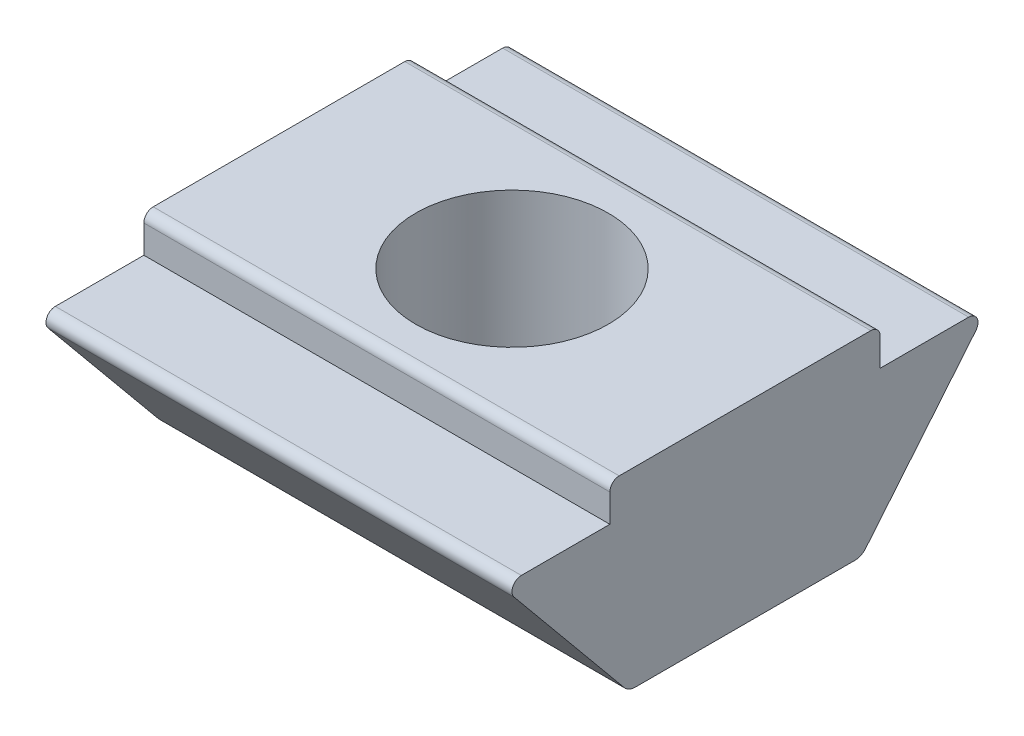
ISO-10303-21;
HEADER;
FILE_DESCRIPTION(('STEP AP214'),'2;1');
FILE_NAME('part.step','',(''),(''),'','','');
FILE_SCHEMA(('AUTOMOTIVE_DESIGN { 1 0 10303 214 1 1 1 1 }'));
ENDSEC;
DATA;
#1=APPLICATION_CONTEXT('core data for automotive mechanical design processes');
#2=APPLICATION_PROTOCOL_DEFINITION('international standard','automotive_design',2000,#1);
#3=PRODUCT_CONTEXT('',#1,'mechanical');
#4=PRODUCT('Part','Part','',(#3));
#5=PRODUCT_RELATED_PRODUCT_CATEGORY('part','',(#4));
#6=PRODUCT_DEFINITION_FORMATION('','',#4);
#7=PRODUCT_DEFINITION_CONTEXT('part definition',#1,'design');
#8=PRODUCT_DEFINITION('design','',#6,#7);
#9=PRODUCT_DEFINITION_SHAPE('','',#8);
#10=(LENGTH_UNIT() NAMED_UNIT(*) SI_UNIT(.MILLI.,.METRE.));
#11=(NAMED_UNIT(*) PLANE_ANGLE_UNIT() SI_UNIT($,.RADIAN.));
#12=(NAMED_UNIT(*) SI_UNIT($,.STERADIAN.) SOLID_ANGLE_UNIT());
#13=UNCERTAINTY_MEASURE_WITH_UNIT(LENGTH_MEASURE(1.E-05),#10,'distance_accuracy_value','');
#14=(GEOMETRIC_REPRESENTATION_CONTEXT(3) GLOBAL_UNCERTAINTY_ASSIGNED_CONTEXT((#13)) GLOBAL_UNIT_ASSIGNED_CONTEXT((#10,
#11,#12)) REPRESENTATION_CONTEXT('',''));
#15=CARTESIAN_POINT('',(0.,0.,0.));
#16=DIRECTION('',(0.,0.,1.));
#17=DIRECTION('',(1.,0.,0.));
#18=AXIS2_PLACEMENT_3D('',#15,#16,#17);
#19=CARTESIAN_POINT('',(5.,-0.327331466080565,-4.95422936732598));
#20=DIRECTION('',(0.,0.636657330402841,0.771146836629917));
#21=DIRECTION('',(0.,-0.771146836629917,0.636657330402841));
#22=AXIS2_PLACEMENT_3D('',#19,#20,#21);
#23=PLANE('',#22);
#24=DIRECTION('',(0.,0.771146836629917,-0.636657330402841));
#25=VECTOR('',#24,1.);
#26=CARTESIAN_POINT('',(5.,-0.327331466080565,-4.95422936732598));
#27=LINE('',#26,#25);
#28=CARTESIAN_POINT('',(5.,-3.19099719912085,-2.58999250067268));
#29=VERTEX_POINT('',#28);
#30=CARTESIAN_POINT('',(5.,-0.327331466080566,-4.95422936732598));
#31=VERTEX_POINT('',#30);
#32=EDGE_CURVE('E138',#29,#31,#27,.T.);
#33=ORIENTED_EDGE('',*,*,#32,.F.);
#34=DIRECTION('',(-1.,0.,0.));
#35=VECTOR('',#34,1.);
#36=CARTESIAN_POINT('',(5.,-3.19099719912085,-2.58999250067268));
#37=LINE('',#36,#35);
#38=CARTESIAN_POINT('',(-5.,-3.19099719912085,-2.58999250067268));
#39=VERTEX_POINT('',#38);
#40=EDGE_CURVE('E183',#29,#39,#37,.T.);
#41=ORIENTED_EDGE('',*,*,#40,.T.);
#42=DIRECTION('',(0.,0.771146836629917,-0.636657330402841));
#43=VECTOR('',#42,1.);
#44=CARTESIAN_POINT('',(-5.,-0.327331466080565,-4.95422936732598));
#45=LINE('',#44,#43);
#46=CARTESIAN_POINT('',(-5.,-0.327331466080566,-4.95422936732598));
#47=VERTEX_POINT('',#46);
#48=EDGE_CURVE('E162',#39,#47,#45,.T.);
#49=ORIENTED_EDGE('',*,*,#48,.T.);
#50=DIRECTION('',(-1.,0.,0.));
#51=VECTOR('',#50,1.);
#52=CARTESIAN_POINT('',(5.,-0.327331466080566,-4.95422936732598));
#53=LINE('',#52,#51);
#54=EDGE_CURVE('E155',#31,#47,#53,.T.);
#55=ORIENTED_EDGE('',*,*,#54,.F.);
#56=EDGE_LOOP('',(#33,#41,#49,#55));
#57=FACE_BOUND('',#56,.T.);
#58=ADVANCED_FACE('F36',(#57),#23,.F.);
#59=CARTESIAN_POINT('',(5.,-0.199999999999999,-4.8));
#60=DIRECTION('',(-1.,0.,0.));
#61=DIRECTION('',(0.,0.,1.));
#62=AXIS2_PLACEMENT_3D('',#59,#60,#61);
#63=CYLINDRICAL_SURFACE('',#62,0.199999999999999);
#64=CARTESIAN_POINT('',(-5.,-0.199999999999999,-4.8));
#65=DIRECTION('',(1.,0.,0.));
#66=DIRECTION('',(0.,0.,1.));
#67=AXIS2_PLACEMENT_3D('',#64,#65,#66);
#68=CIRCLE('',#67,0.199999999999999);
#69=CARTESIAN_POINT('',(-5.,0.,-4.8));
#70=VERTEX_POINT('',#69);
#71=EDGE_CURVE('E222',#47,#70,#68,.T.);
#72=ORIENTED_EDGE('',*,*,#71,.T.);
#73=DIRECTION('',(-1.,0.,0.));
#74=VECTOR('',#73,1.);
#75=CARTESIAN_POINT('',(5.,0.,-4.8));
#76=LINE('',#75,#74);
#77=CARTESIAN_POINT('',(5.,0.,-4.8));
#78=VERTEX_POINT('',#77);
#79=EDGE_CURVE('E157',#78,#70,#76,.T.);
#80=ORIENTED_EDGE('',*,*,#79,.F.);
#81=CARTESIAN_POINT('',(5.,-0.199999999999999,-4.8));
#82=DIRECTION('',(1.,0.,0.));
#83=DIRECTION('',(0.,0.,1.));
#84=AXIS2_PLACEMENT_3D('',#81,#82,#83);
#85=CIRCLE('',#84,0.199999999999999);
#86=EDGE_CURVE('E141',#31,#78,#85,.T.);
#87=ORIENTED_EDGE('',*,*,#86,.F.);
#88=ORIENTED_EDGE('',*,*,#54,.T.);
#89=EDGE_LOOP('',(#72,#80,#87,#88));
#90=FACE_BOUND('',#89,.T.);
#91=ADVANCED_FACE('F154',(#90),#63,.T.);
#92=CARTESIAN_POINT('',(5.,0.,-2.9));
#93=DIRECTION('',(0.,-1.,0.));
#94=DIRECTION('',(0.,0.,-1.));
#95=AXIS2_PLACEMENT_3D('',#92,#93,#94);
#96=PLANE('',#95);
#97=DIRECTION('',(0.,0.,1.));
#98=VECTOR('',#97,1.);
#99=CARTESIAN_POINT('',(-5.,0.,-2.9));
#100=LINE('',#99,#98);
#101=CARTESIAN_POINT('',(-5.,0.,-2.9));
#102=VERTEX_POINT('',#101);
#103=EDGE_CURVE('E218',#70,#102,#100,.T.);
#104=ORIENTED_EDGE('',*,*,#103,.T.);
#105=DIRECTION('',(-1.,0.,0.));
#106=VECTOR('',#105,1.);
#107=CARTESIAN_POINT('',(5.,0.,-2.9));
#108=LINE('',#107,#106);
#109=CARTESIAN_POINT('',(5.,0.,-2.9));
#110=VERTEX_POINT('',#109);
#111=EDGE_CURVE('E168',#110,#102,#108,.T.);
#112=ORIENTED_EDGE('',*,*,#111,.F.);
#113=DIRECTION('',(0.,0.,1.));
#114=VECTOR('',#113,1.);
#115=CARTESIAN_POINT('',(5.,0.,-2.9));
#116=LINE('',#115,#114);
#117=EDGE_CURVE('E159',#78,#110,#116,.T.);
#118=ORIENTED_EDGE('',*,*,#117,.F.);
#119=ORIENTED_EDGE('',*,*,#79,.T.);
#120=EDGE_LOOP('',(#104,#112,#118,#119));
#121=FACE_BOUND('',#120,.T.);
#122=ADVANCED_FACE('F275',(#121),#96,.F.);
#123=CARTESIAN_POINT('',(5.,0.8,-2.9));
#124=DIRECTION('',(0.,0.,1.));
#125=DIRECTION('',(1.,0.,0.));
#126=AXIS2_PLACEMENT_3D('',#123,#124,#125);
#127=PLANE('',#126);
#128=DIRECTION('',(0.,1.,0.));
#129=VECTOR('',#128,1.);
#130=CARTESIAN_POINT('',(-5.,0.8,-2.9));
#131=LINE('',#130,#129);
#132=CARTESIAN_POINT('',(-5.,0.6,-2.9));
#133=VERTEX_POINT('',#132);
#134=EDGE_CURVE('E213',#102,#133,#131,.T.);
#135=ORIENTED_EDGE('',*,*,#134,.T.);
#136=DIRECTION('',(-1.,0.,0.));
#137=VECTOR('',#136,1.);
#138=CARTESIAN_POINT('',(5.,0.6,-2.9));
#139=LINE('',#138,#137);
#140=CARTESIAN_POINT('',(5.,0.6,-2.9));
#141=VERTEX_POINT('',#140);
#142=EDGE_CURVE('E59',#133,#141,#139,.F.);
#143=ORIENTED_EDGE('',*,*,#142,.T.);
#144=DIRECTION('',(0.,1.,0.));
#145=VECTOR('',#144,1.);
#146=CARTESIAN_POINT('',(5.,0.8,-2.9));
#147=LINE('',#146,#145);
#148=EDGE_CURVE('E198',#110,#141,#147,.T.);
#149=ORIENTED_EDGE('',*,*,#148,.F.);
#150=ORIENTED_EDGE('',*,*,#111,.T.);
#151=EDGE_LOOP('',(#135,#143,#149,#150));
#152=FACE_BOUND('',#151,.T.);
#153=ADVANCED_FACE('F216',(#152),#127,.F.);
#154=CARTESIAN_POINT('',(5.,0.799999999999999,2.9));
#155=DIRECTION('',(0.,-1.,0.));
#156=DIRECTION('',(0.,0.,-1.));
#157=AXIS2_PLACEMENT_3D('',#154,#155,#156);
#158=PLANE('',#157);
#159=CARTESIAN_POINT('',(0.,0.799999999999999,0.));
#160=DIRECTION('',(0.,1.,0.));
#161=DIRECTION('',(0.,0.,1.));
#162=AXIS2_PLACEMENT_3D('',#159,#160,#161);
#163=CIRCLE('',#162,2.067);
#164=CARTESIAN_POINT('',(0.,0.799999999999999,2.067));
#165=VERTEX_POINT('',#164);
#166=EDGE_CURVE('E448',#165,#165,#163,.T.);
#167=ORIENTED_EDGE('',*,*,#166,.F.);
#168=EDGE_LOOP('',(#167));
#169=FACE_BOUND('',#168,.T.);
#170=DIRECTION('',(0.,0.,1.));
#171=VECTOR('',#170,1.);
#172=CARTESIAN_POINT('',(5.,0.799999999999999,2.9));
#173=LINE('',#172,#171);
#174=CARTESIAN_POINT('',(5.,0.8,-2.7));
#175=VERTEX_POINT('',#174);
#176=CARTESIAN_POINT('',(5.,0.799999999999999,2.7));
#177=VERTEX_POINT('',#176);
#178=EDGE_CURVE('E197',#175,#177,#173,.T.);
#179=ORIENTED_EDGE('',*,*,#178,.F.);
#180=DIRECTION('',(-1.,0.,0.));
#181=VECTOR('',#180,1.);
#182=CARTESIAN_POINT('',(5.,0.8,-2.7));
#183=LINE('',#182,#181);
#184=CARTESIAN_POINT('',(-5.,0.8,-2.7));
#185=VERTEX_POINT('',#184);
#186=EDGE_CURVE('E187',#175,#185,#183,.T.);
#187=ORIENTED_EDGE('',*,*,#186,.T.);
#188=DIRECTION('',(0.,0.,1.));
#189=VECTOR('',#188,1.);
#190=CARTESIAN_POINT('',(-5.,0.799999999999999,2.9));
#191=LINE('',#190,#189);
#192=CARTESIAN_POINT('',(-5.,0.799999999999999,2.7));
#193=VERTEX_POINT('',#192);
#194=EDGE_CURVE('E214',#185,#193,#191,.T.);
#195=ORIENTED_EDGE('',*,*,#194,.T.);
#196=DIRECTION('',(-1.,0.,0.));
#197=VECTOR('',#196,1.);
#198=CARTESIAN_POINT('',(5.,0.799999999999999,2.7));
#199=LINE('',#198,#197);
#200=EDGE_CURVE('E185',#193,#177,#199,.F.);
#201=ORIENTED_EDGE('',*,*,#200,.T.);
#202=EDGE_LOOP('',(#179,#187,#195,#201));
#203=FACE_BOUND('',#202,.T.);
#204=ADVANCED_FACE('F202',(#169,#203),#158,.F.);
#205=CARTESIAN_POINT('',(5.,0.,2.9));
#206=DIRECTION('',(0.,0.,-1.));
#207=DIRECTION('',(-1.,0.,0.));
#208=AXIS2_PLACEMENT_3D('',#205,#206,#207);
#209=PLANE('',#208);
#210=DIRECTION('',(0.,-1.,0.));
#211=VECTOR('',#210,1.);
#212=CARTESIAN_POINT('',(5.,0.,2.9));
#213=LINE('',#212,#211);
#214=CARTESIAN_POINT('',(5.,0.599999999999999,2.9));
#215=VERTEX_POINT('',#214);
#216=CARTESIAN_POINT('',(5.,0.,2.9));
#217=VERTEX_POINT('',#216);
#218=EDGE_CURVE('E206',#215,#217,#213,.T.);
#219=ORIENTED_EDGE('',*,*,#218,.F.);
#220=DIRECTION('',(-1.,0.,0.));
#221=VECTOR('',#220,1.);
#222=CARTESIAN_POINT('',(5.,0.599999999999999,2.9));
#223=LINE('',#222,#221);
#224=CARTESIAN_POINT('',(-5.,0.599999999999999,2.9));
#225=VERTEX_POINT('',#224);
#226=EDGE_CURVE('E11',#215,#225,#223,.T.);
#227=ORIENTED_EDGE('',*,*,#226,.T.);
#228=DIRECTION('',(0.,-1.,0.));
#229=VECTOR('',#228,1.);
#230=CARTESIAN_POINT('',(-5.,0.,2.9));
#231=LINE('',#230,#229);
#232=CARTESIAN_POINT('',(-5.,0.,2.9));
#233=VERTEX_POINT('',#232);
#234=EDGE_CURVE('E220',#225,#233,#231,.T.);
#235=ORIENTED_EDGE('',*,*,#234,.T.);
#236=DIRECTION('',(-1.,0.,0.));
#237=VECTOR('',#236,1.);
#238=CARTESIAN_POINT('',(5.,0.,2.9));
#239=LINE('',#238,#237);
#240=EDGE_CURVE('E243',#217,#233,#239,.T.);
#241=ORIENTED_EDGE('',*,*,#240,.F.);
#242=EDGE_LOOP('',(#219,#227,#235,#241));
#243=FACE_BOUND('',#242,.T.);
#244=ADVANCED_FACE('F280',(#243),#209,.F.);
#245=CARTESIAN_POINT('',(5.,0.,4.8));
#246=DIRECTION('',(0.,-1.,0.));
#247=DIRECTION('',(0.,0.,-1.));
#248=AXIS2_PLACEMENT_3D('',#245,#246,#247);
#249=PLANE('',#248);
#250=DIRECTION('',(0.,0.,1.));
#251=VECTOR('',#250,1.);
#252=CARTESIAN_POINT('',(-5.,0.,4.8));
#253=LINE('',#252,#251);
#254=CARTESIAN_POINT('',(-5.,0.,4.8));
#255=VERTEX_POINT('',#254);
#256=EDGE_CURVE('E227',#233,#255,#253,.T.);
#257=ORIENTED_EDGE('',*,*,#256,.T.);
#258=DIRECTION('',(-1.,0.,0.));
#259=VECTOR('',#258,1.);
#260=CARTESIAN_POINT('',(5.,0.,4.8));
#261=LINE('',#260,#259);
#262=CARTESIAN_POINT('',(5.,0.,4.8));
#263=VERTEX_POINT('',#262);
#264=EDGE_CURVE('E239',#263,#255,#261,.T.);
#265=ORIENTED_EDGE('',*,*,#264,.F.);
#266=DIRECTION('',(0.,0.,1.));
#267=VECTOR('',#266,1.);
#268=CARTESIAN_POINT('',(5.,0.,4.8));
#269=LINE('',#268,#267);
#270=EDGE_CURVE('E251',#217,#263,#269,.T.);
#271=ORIENTED_EDGE('',*,*,#270,.F.);
#272=ORIENTED_EDGE('',*,*,#240,.T.);
#273=EDGE_LOOP('',(#257,#265,#271,#272));
#274=FACE_BOUND('',#273,.T.);
#275=ADVANCED_FACE('F249',(#274),#249,.F.);
#276=CARTESIAN_POINT('',(5.,-0.2,4.8));
#277=DIRECTION('',(-1.,0.,0.));
#278=DIRECTION('',(0.,0.,1.));
#279=AXIS2_PLACEMENT_3D('',#276,#277,#278);
#280=CYLINDRICAL_SURFACE('',#279,0.199999999999998);
#281=CARTESIAN_POINT('',(-5.,-0.2,4.8));
#282=DIRECTION('',(1.,0.,0.));
#283=DIRECTION('',(0.,0.,1.));
#284=AXIS2_PLACEMENT_3D('',#281,#282,#283);
#285=CIRCLE('',#284,0.199999999999998);
#286=CARTESIAN_POINT('',(-5.,-0.327331466080566,4.95422936732598));
#287=VERTEX_POINT('',#286);
#288=EDGE_CURVE('E229',#255,#287,#285,.T.);
#289=ORIENTED_EDGE('',*,*,#288,.T.);
#290=DIRECTION('',(-1.,0.,0.));
#291=VECTOR('',#290,1.);
#292=CARTESIAN_POINT('',(5.,-0.327331466080566,4.95422936732598));
#293=LINE('',#292,#291);
#294=CARTESIAN_POINT('',(5.,-0.327331466080566,4.95422936732598));
#295=VERTEX_POINT('',#294);
#296=EDGE_CURVE('E236',#295,#287,#293,.T.);
#297=ORIENTED_EDGE('',*,*,#296,.F.);
#298=CARTESIAN_POINT('',(5.,-0.2,4.8));
#299=DIRECTION('',(1.,0.,0.));
#300=DIRECTION('',(0.,0.,1.));
#301=AXIS2_PLACEMENT_3D('',#298,#299,#300);
#302=CIRCLE('',#301,0.199999999999998);
#303=EDGE_CURVE('E267',#263,#295,#302,.T.);
#304=ORIENTED_EDGE('',*,*,#303,.F.);
#305=ORIENTED_EDGE('',*,*,#264,.T.);
#306=EDGE_LOOP('',(#289,#297,#304,#305));
#307=FACE_BOUND('',#306,.T.);
#308=ADVANCED_FACE('F258',(#307),#280,.T.);
#309=CARTESIAN_POINT('',(5.,-3.3,2.5));
#310=DIRECTION('',(0.,0.636657330402841,-0.771146836629917));
#311=DIRECTION('',(0.,0.771146836629917,0.636657330402841));
#312=AXIS2_PLACEMENT_3D('',#309,#310,#311);
#313=PLANE('',#312);
#314=DIRECTION('',(0.,-0.771146836629917,-0.636657330402841));
#315=VECTOR('',#314,1.);
#316=CARTESIAN_POINT('',(-5.,-3.3,2.5));
#317=LINE('',#316,#315);
#318=CARTESIAN_POINT('',(-5.,-3.19099719912085,2.58999250067268));
#319=VERTEX_POINT('',#318);
#320=EDGE_CURVE('E231',#287,#319,#317,.T.);
#321=ORIENTED_EDGE('',*,*,#320,.T.);
#322=DIRECTION('',(-1.,0.,0.));
#323=VECTOR('',#322,1.);
#324=CARTESIAN_POINT('',(5.,-3.19099719912085,2.58999250067268));
#325=LINE('',#324,#323);
#326=CARTESIAN_POINT('',(5.,-3.19099719912085,2.58999250067268));
#327=VERTEX_POINT('',#326);
#328=EDGE_CURVE('E178',#319,#327,#325,.F.);
#329=ORIENTED_EDGE('',*,*,#328,.T.);
#330=DIRECTION('',(0.,-0.771146836629917,-0.636657330402841));
#331=VECTOR('',#330,1.);
#332=CARTESIAN_POINT('',(5.,-3.3,2.5));
#333=LINE('',#332,#331);
#334=EDGE_CURVE('E265',#295,#327,#333,.T.);
#335=ORIENTED_EDGE('',*,*,#334,.F.);
#336=ORIENTED_EDGE('',*,*,#296,.T.);
#337=EDGE_LOOP('',(#321,#329,#335,#336));
#338=FACE_BOUND('',#337,.T.);
#339=ADVANCED_FACE('F262',(#338),#313,.F.);
#340=CARTESIAN_POINT('',(5.,-3.3,-2.5));
#341=DIRECTION('',(0.,1.,0.));
#342=DIRECTION('',(0.,0.,1.));
#343=AXIS2_PLACEMENT_3D('',#340,#341,#342);
#344=PLANE('',#343);
#345=CARTESIAN_POINT('',(0.,-3.3,0.));
#346=DIRECTION('',(0.,1.,0.));
#347=DIRECTION('',(0.,0.,1.));
#348=AXIS2_PLACEMENT_3D('',#345,#346,#347);
#349=CIRCLE('',#348,2.067);
#350=CARTESIAN_POINT('',(0.,-3.3,2.067));
#351=VERTEX_POINT('',#350);
#352=EDGE_CURVE('E273',#351,#351,#349,.T.);
#353=ORIENTED_EDGE('',*,*,#352,.T.);
#354=EDGE_LOOP('',(#353));
#355=FACE_BOUND('',#354,.T.);
#356=DIRECTION('',(0.,0.,-1.));
#357=VECTOR('',#356,1.);
#358=CARTESIAN_POINT('',(5.,-3.3,-2.5));
#359=LINE('',#358,#357);
#360=CARTESIAN_POINT('',(5.,-3.3,2.3586484496837));
#361=VERTEX_POINT('',#360);
#362=CARTESIAN_POINT('',(5.,-3.3,-2.3586484496837));
#363=VERTEX_POINT('',#362);
#364=EDGE_CURVE('E240',#361,#363,#359,.T.);
#365=ORIENTED_EDGE('',*,*,#364,.F.);
#366=DIRECTION('',(-1.,0.,0.));
#367=VECTOR('',#366,1.);
#368=CARTESIAN_POINT('',(5.,-3.3,2.3586484496837));
#369=LINE('',#368,#367);
#370=CARTESIAN_POINT('',(-5.,-3.3,2.3586484496837));
#371=VERTEX_POINT('',#370);
#372=EDGE_CURVE('E166',#361,#371,#369,.T.);
#373=ORIENTED_EDGE('',*,*,#372,.T.);
#374=DIRECTION('',(0.,0.,-1.));
#375=VECTOR('',#374,1.);
#376=CARTESIAN_POINT('',(-5.,-3.3,-2.5));
#377=LINE('',#376,#375);
#378=CARTESIAN_POINT('',(-5.,-3.3,-2.3586484496837));
#379=VERTEX_POINT('',#378);
#380=EDGE_CURVE('E150',#371,#379,#377,.T.);
#381=ORIENTED_EDGE('',*,*,#380,.T.);
#382=DIRECTION('',(-1.,0.,0.));
#383=VECTOR('',#382,1.);
#384=CARTESIAN_POINT('',(5.,-3.3,-2.3586484496837));
#385=LINE('',#384,#383);
#386=EDGE_CURVE('E164',#379,#363,#385,.F.);
#387=ORIENTED_EDGE('',*,*,#386,.T.);
#388=EDGE_LOOP('',(#365,#373,#381,#387));
#389=FACE_BOUND('',#388,.T.);
#390=ADVANCED_FACE('F311',(#355,#389),#344,.F.);
#391=CARTESIAN_POINT('',(5.,-0.2,4.8));
#392=DIRECTION('',(-1.,0.,0.));
#393=DIRECTION('',(0.,0.,1.));
#394=AXIS2_PLACEMENT_3D('',#391,#392,#393);
#395=PLANE('',#394);
#396=ORIENTED_EDGE('',*,*,#148,.T.);
#397=CARTESIAN_POINT('',(5.,0.6,-2.7));
#398=DIRECTION('',(-1.,0.,0.));
#399=DIRECTION('',(0.,0.,1.));
#400=AXIS2_PLACEMENT_3D('',#397,#398,#399);
#401=CIRCLE('',#400,0.2);
#402=EDGE_CURVE('E44',#141,#175,#401,.F.);
#403=ORIENTED_EDGE('',*,*,#402,.T.);
#404=ORIENTED_EDGE('',*,*,#178,.T.);
#405=CARTESIAN_POINT('',(5.,0.599999999999999,2.7));
#406=DIRECTION('',(-1.,0.,0.));
#407=DIRECTION('',(0.,0.,1.));
#408=AXIS2_PLACEMENT_3D('',#405,#406,#407);
#409=CIRCLE('',#408,0.2);
#410=EDGE_CURVE('E51',#177,#215,#409,.F.);
#411=ORIENTED_EDGE('',*,*,#410,.T.);
#412=ORIENTED_EDGE('',*,*,#218,.T.);
#413=ORIENTED_EDGE('',*,*,#270,.T.);
#414=ORIENTED_EDGE('',*,*,#303,.T.);
#415=ORIENTED_EDGE('',*,*,#334,.T.);
#416=CARTESIAN_POINT('',(5.,-3.,2.3586484496837));
#417=DIRECTION('',(-1.,0.,0.));
#418=DIRECTION('',(0.,0.,1.));
#419=AXIS2_PLACEMENT_3D('',#416,#417,#418);
#420=CIRCLE('',#419,0.3);
#421=EDGE_CURVE('E181',#327,#361,#420,.F.);
#422=ORIENTED_EDGE('',*,*,#421,.T.);
#423=ORIENTED_EDGE('',*,*,#364,.T.);
#424=CARTESIAN_POINT('',(5.,-3.,-2.3586484496837));
#425=DIRECTION('',(-1.,0.,0.));
#426=DIRECTION('',(0.,0.,1.));
#427=AXIS2_PLACEMENT_3D('',#424,#425,#426);
#428=CIRCLE('',#427,0.3);
#429=EDGE_CURVE('E145',#363,#29,#428,.F.);
#430=ORIENTED_EDGE('',*,*,#429,.T.);
#431=ORIENTED_EDGE('',*,*,#32,.T.);
#432=ORIENTED_EDGE('',*,*,#86,.T.);
#433=ORIENTED_EDGE('',*,*,#117,.T.);
#434=EDGE_LOOP('',(#396,#403,#404,#411,#412,#413,#414,#415,#422,#423,#430,#431,#432,#433));
#435=FACE_BOUND('',#434,.T.);
#436=ADVANCED_FACE('F140',(#435),#395,.F.);
#437=CARTESIAN_POINT('',(-5.,-0.2,4.8));
#438=DIRECTION('',(-1.,0.,0.));
#439=DIRECTION('',(0.,0.,1.));
#440=AXIS2_PLACEMENT_3D('',#437,#438,#439);
#441=PLANE('',#440);
#442=ORIENTED_EDGE('',*,*,#194,.F.);
#443=CARTESIAN_POINT('',(-5.,0.6,-2.7));
#444=DIRECTION('',(-1.,0.,0.));
#445=DIRECTION('',(0.,0.,1.));
#446=AXIS2_PLACEMENT_3D('',#443,#444,#445);
#447=CIRCLE('',#446,0.2);
#448=EDGE_CURVE('E192',#185,#133,#447,.T.);
#449=ORIENTED_EDGE('',*,*,#448,.T.);
#450=ORIENTED_EDGE('',*,*,#134,.F.);
#451=ORIENTED_EDGE('',*,*,#103,.F.);
#452=ORIENTED_EDGE('',*,*,#71,.F.);
#453=ORIENTED_EDGE('',*,*,#48,.F.);
#454=CARTESIAN_POINT('',(-5.,-3.,-2.3586484496837));
#455=DIRECTION('',(-1.,0.,0.));
#456=DIRECTION('',(0.,0.,1.));
#457=AXIS2_PLACEMENT_3D('',#454,#455,#456);
#458=CIRCLE('',#457,0.3);
#459=EDGE_CURVE('E174',#39,#379,#458,.T.);
#460=ORIENTED_EDGE('',*,*,#459,.T.);
#461=ORIENTED_EDGE('',*,*,#380,.F.);
#462=CARTESIAN_POINT('',(-5.,-3.,2.3586484496837));
#463=DIRECTION('',(-1.,0.,0.));
#464=DIRECTION('',(0.,0.,1.));
#465=AXIS2_PLACEMENT_3D('',#462,#463,#464);
#466=CIRCLE('',#465,0.3);
#467=EDGE_CURVE('E176',#371,#319,#466,.T.);
#468=ORIENTED_EDGE('',*,*,#467,.T.);
#469=ORIENTED_EDGE('',*,*,#320,.F.);
#470=ORIENTED_EDGE('',*,*,#288,.F.);
#471=ORIENTED_EDGE('',*,*,#256,.F.);
#472=ORIENTED_EDGE('',*,*,#234,.F.);
#473=CARTESIAN_POINT('',(-5.,0.599999999999999,2.7));
#474=DIRECTION('',(-1.,0.,0.));
#475=DIRECTION('',(0.,0.,1.));
#476=AXIS2_PLACEMENT_3D('',#473,#474,#475);
#477=CIRCLE('',#476,0.2);
#478=EDGE_CURVE('E190',#225,#193,#477,.T.);
#479=ORIENTED_EDGE('',*,*,#478,.T.);
#480=EDGE_LOOP('',(#442,#449,#450,#451,#452,#453,#460,#461,#468,#469,#470,#471,#472,#479));
#481=FACE_BOUND('',#480,.T.);
#482=ADVANCED_FACE('F211',(#481),#441,.T.);
#483=CARTESIAN_POINT('',(5.,-3.,2.3586484496837));
#484=DIRECTION('',(-1.,0.,0.));
#485=DIRECTION('',(0.,0.,1.));
#486=AXIS2_PLACEMENT_3D('',#483,#484,#485);
#487=CYLINDRICAL_SURFACE('',#486,0.3);
#488=ORIENTED_EDGE('',*,*,#421,.F.);
#489=ORIENTED_EDGE('',*,*,#328,.F.);
#490=ORIENTED_EDGE('',*,*,#467,.F.);
#491=ORIENTED_EDGE('',*,*,#372,.F.);
#492=EDGE_LOOP('',(#488,#489,#490,#491));
#493=FACE_BOUND('',#492,.T.);
#494=ADVANCED_FACE('F299',(#493),#487,.T.);
#495=CARTESIAN_POINT('',(5.,-3.,-2.3586484496837));
#496=DIRECTION('',(-1.,0.,0.));
#497=DIRECTION('',(0.,0.,1.));
#498=AXIS2_PLACEMENT_3D('',#495,#496,#497);
#499=CYLINDRICAL_SURFACE('',#498,0.3);
#500=ORIENTED_EDGE('',*,*,#429,.F.);
#501=ORIENTED_EDGE('',*,*,#386,.F.);
#502=ORIENTED_EDGE('',*,*,#459,.F.);
#503=ORIENTED_EDGE('',*,*,#40,.F.);
#504=EDGE_LOOP('',(#500,#501,#502,#503));
#505=FACE_BOUND('',#504,.T.);
#506=ADVANCED_FACE('F290',(#505),#499,.T.);
#507=CARTESIAN_POINT('',(5.,0.6,-2.7));
#508=DIRECTION('',(-1.,0.,0.));
#509=DIRECTION('',(0.,0.,1.));
#510=AXIS2_PLACEMENT_3D('',#507,#508,#509);
#511=CYLINDRICAL_SURFACE('',#510,0.2);
#512=ORIENTED_EDGE('',*,*,#402,.F.);
#513=ORIENTED_EDGE('',*,*,#142,.F.);
#514=ORIENTED_EDGE('',*,*,#448,.F.);
#515=ORIENTED_EDGE('',*,*,#186,.F.);
#516=EDGE_LOOP('',(#512,#513,#514,#515));
#517=FACE_BOUND('',#516,.T.);
#518=ADVANCED_FACE('F208',(#517),#511,.T.);
#519=CARTESIAN_POINT('',(5.,0.599999999999999,2.7));
#520=DIRECTION('',(-1.,0.,0.));
#521=DIRECTION('',(0.,0.,1.));
#522=AXIS2_PLACEMENT_3D('',#519,#520,#521);
#523=CYLINDRICAL_SURFACE('',#522,0.2);
#524=ORIENTED_EDGE('',*,*,#410,.F.);
#525=ORIENTED_EDGE('',*,*,#200,.F.);
#526=ORIENTED_EDGE('',*,*,#478,.F.);
#527=ORIENTED_EDGE('',*,*,#226,.F.);
#528=EDGE_LOOP('',(#524,#525,#526,#527));
#529=FACE_BOUND('',#528,.T.);
#530=ADVANCED_FACE('F38',(#529),#523,.T.);
#531=CARTESIAN_POINT('',(0.,0.799999999999999,0.));
#532=DIRECTION('',(0.,1.,0.));
#533=DIRECTION('',(0.,0.,1.));
#534=AXIS2_PLACEMENT_3D('',#531,#532,#533);
#535=CYLINDRICAL_SURFACE('',#534,2.067);
#536=ORIENTED_EDGE('',*,*,#352,.F.);
#537=EDGE_LOOP('',(#536));
#538=FACE_BOUND('',#537,.T.);
#539=ORIENTED_EDGE('',*,*,#166,.T.);
#540=EDGE_LOOP('',(#539));
#541=FACE_BOUND('',#540,.T.);
#542=ADVANCED_FACE('F283',(#538,#541),#535,.F.);
#543=CLOSED_SHELL('',(#58,#91,#122,#153,#204,#244,#275,#308,#339,#390,#436,#482,#494,#506,#518,
#530,#542));
#544=MANIFOLD_SOLID_BREP('B2',#543);
#545=ADVANCED_BREP_SHAPE_REPRESENTATION('',(#18,#544),#14);
#546=SHAPE_DEFINITION_REPRESENTATION(#9,#545);
ENDSEC;
END-ISO-10303-21;
